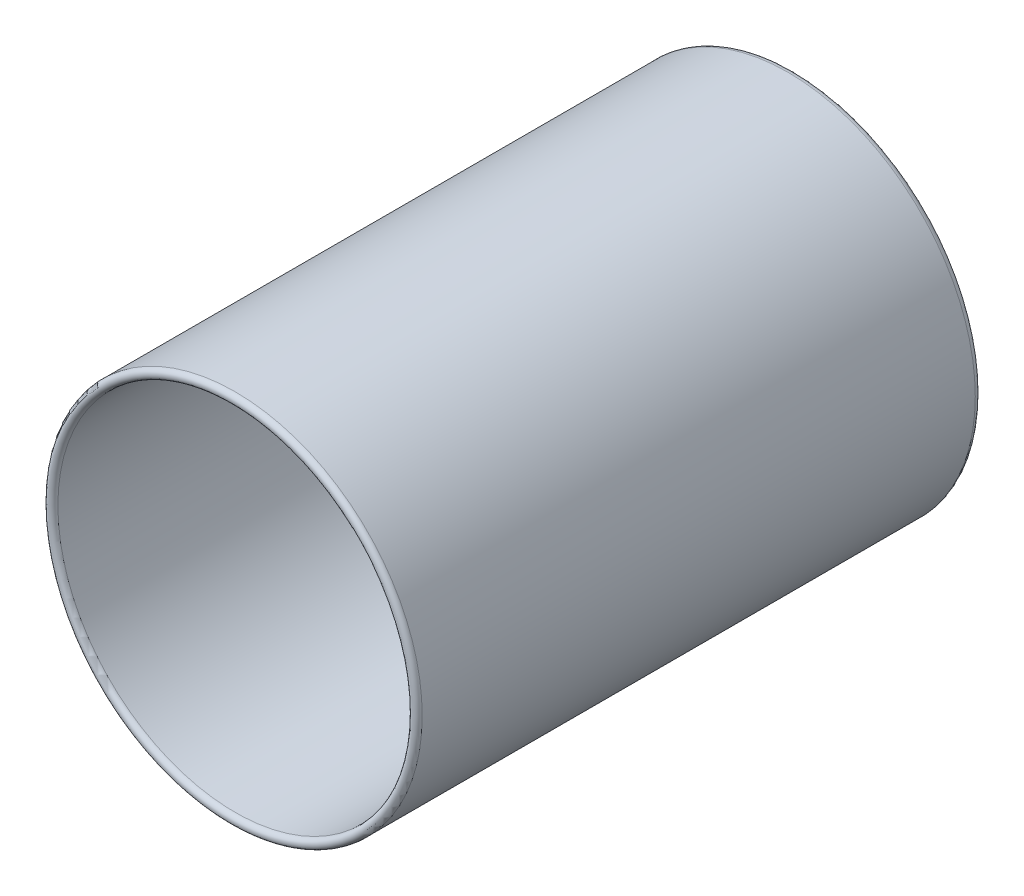
ISO-10303-21;
HEADER;
FILE_DESCRIPTION(('STEP AP214'),'2;1');
FILE_NAME('part.step','',(''),(''),'','','');
FILE_SCHEMA(('AUTOMOTIVE_DESIGN { 1 0 10303 214 1 1 1 1 }'));
ENDSEC;
DATA;
#1=APPLICATION_CONTEXT('core data for automotive mechanical design processes');
#2=APPLICATION_PROTOCOL_DEFINITION('international standard','automotive_design',2000,#1);
#3=PRODUCT_CONTEXT('',#1,'mechanical');
#4=PRODUCT('Part','Part','',(#3));
#5=PRODUCT_RELATED_PRODUCT_CATEGORY('part','',(#4));
#6=PRODUCT_DEFINITION_FORMATION('','',#4);
#7=PRODUCT_DEFINITION_CONTEXT('part definition',#1,'design');
#8=PRODUCT_DEFINITION('design','',#6,#7);
#9=PRODUCT_DEFINITION_SHAPE('','',#8);
#10=(LENGTH_UNIT() NAMED_UNIT(*) SI_UNIT(.MILLI.,.METRE.));
#11=(NAMED_UNIT(*) PLANE_ANGLE_UNIT() SI_UNIT($,.RADIAN.));
#12=(NAMED_UNIT(*) SI_UNIT($,.STERADIAN.) SOLID_ANGLE_UNIT());
#13=UNCERTAINTY_MEASURE_WITH_UNIT(LENGTH_MEASURE(1.E-05),#10,'distance_accuracy_value','');
#14=(GEOMETRIC_REPRESENTATION_CONTEXT(3) GLOBAL_UNCERTAINTY_ASSIGNED_CONTEXT((#13)) GLOBAL_UNIT_ASSIGNED_CONTEXT((#10,
#11,#12)) REPRESENTATION_CONTEXT('',''));
#15=CARTESIAN_POINT('',(0.,0.,0.));
#16=DIRECTION('',(0.,0.,1.));
#17=DIRECTION('',(1.,0.,0.));
#18=AXIS2_PLACEMENT_3D('',#15,#16,#17);
#19=CARTESIAN_POINT('',(0.,0.,85.25));
#20=DIRECTION('',(0.,0.,1.));
#21=DIRECTION('',(1.,0.,0.));
#22=AXIS2_PLACEMENT_3D('',#19,#20,#21);
#23=TOROIDAL_SURFACE('',#22,27.75,0.750000000000002);
#24=CARTESIAN_POINT('',(0.,0.,85.25));
#25=DIRECTION('',(0.,0.,1.));
#26=DIRECTION('',(1.,0.,0.));
#27=AXIS2_PLACEMENT_3D('',#24,#25,#26);
#28=CIRCLE('',#27,28.5);
#29=CARTESIAN_POINT('',(28.5,0.,85.25));
#30=VERTEX_POINT('',#29);
#31=EDGE_CURVE('E53',#30,#30,#28,.F.);
#32=ORIENTED_EDGE('',*,*,#31,.F.);
#33=EDGE_LOOP('',(#32));
#34=FACE_BOUND('',#33,.T.);
#35=CARTESIAN_POINT('',(0.,0.,85.25));
#36=DIRECTION('',(0.,0.,1.));
#37=DIRECTION('',(1.,0.,0.));
#38=AXIS2_PLACEMENT_3D('',#35,#36,#37);
#39=CIRCLE('',#38,27.);
#40=CARTESIAN_POINT('',(27.,0.,85.25));
#41=VERTEX_POINT('',#40);
#42=EDGE_CURVE('E10',#41,#41,#39,.T.);
#43=ORIENTED_EDGE('',*,*,#42,.F.);
#44=EDGE_LOOP('',(#43));
#45=FACE_BOUND('',#44,.T.);
#46=ADVANCED_FACE('F45',(#34,#45),#23,.T.);
#47=CARTESIAN_POINT('',(0.,0.,86.));
#48=DIRECTION('',(0.,0.,-1.));
#49=DIRECTION('',(-1.,0.,0.));
#50=AXIS2_PLACEMENT_3D('',#47,#48,#49);
#51=CYLINDRICAL_SURFACE('',#50,28.5);
#52=ORIENTED_EDGE('',*,*,#31,.T.);
#53=EDGE_LOOP('',(#52));
#54=FACE_BOUND('',#53,.T.);
#55=CARTESIAN_POINT('',(0.,0.,1.));
#56=DIRECTION('',(0.,0.,1.));
#57=DIRECTION('',(1.,0.,0.));
#58=AXIS2_PLACEMENT_3D('',#55,#56,#57);
#59=CIRCLE('',#58,28.5);
#60=CARTESIAN_POINT('',(28.5,0.,1.));
#61=VERTEX_POINT('',#60);
#62=EDGE_CURVE('E63',#61,#61,#59,.T.);
#63=ORIENTED_EDGE('',*,*,#62,.T.);
#64=EDGE_LOOP('',(#63));
#65=FACE_BOUND('',#64,.T.);
#66=ADVANCED_FACE('F87',(#54,#65),#51,.T.);
#67=CARTESIAN_POINT('',(0.,0.,0.));
#68=DIRECTION('',(0.,0.,1.));
#69=DIRECTION('',(1.,0.,0.));
#70=AXIS2_PLACEMENT_3D('',#67,#68,#69);
#71=PLANE('',#70);
#72=CARTESIAN_POINT('',(0.,0.,0.));
#73=DIRECTION('',(0.,0.,1.));
#74=DIRECTION('',(1.,0.,0.));
#75=AXIS2_PLACEMENT_3D('',#72,#73,#74);
#76=CIRCLE('',#75,27.5);
#77=CARTESIAN_POINT('',(27.5,0.,0.));
#78=VERTEX_POINT('',#77);
#79=EDGE_CURVE('E58',#78,#78,#76,.F.);
#80=ORIENTED_EDGE('',*,*,#79,.T.);
#81=EDGE_LOOP('',(#80));
#82=FACE_BOUND('',#81,.T.);
#83=ADVANCED_FACE('F78',(#82),#71,.F.);
#84=CARTESIAN_POINT('',(0.,0.,1.99999999999999));
#85=DIRECTION('',(0.,0.,1.));
#86=DIRECTION('',(1.,0.,0.));
#87=AXIS2_PLACEMENT_3D('',#84,#85,#86);
#88=CYLINDRICAL_SURFACE('',#87,27.);
#89=CARTESIAN_POINT('',(0.,0.,1.99999999999999));
#90=DIRECTION('',(0.,0.,1.));
#91=DIRECTION('',(1.,0.,0.));
#92=AXIS2_PLACEMENT_3D('',#89,#90,#91);
#93=CIRCLE('',#92,27.);
#94=CARTESIAN_POINT('',(27.,0.,1.99999999999999));
#95=VERTEX_POINT('',#94);
#96=EDGE_CURVE('E69',#95,#95,#93,.T.);
#97=CARTESIAN_POINT('',(27.,0.,85.25));
#98=CARTESIAN_POINT('',(27.,0.,84.3828125));
#99=CARTESIAN_POINT('',(27.,0.,83.515625));
#100=CARTESIAN_POINT('',(27.,0.,81.78125));
#101=CARTESIAN_POINT('',(27.,0.,80.9140625));
#102=CARTESIAN_POINT('',(27.,0.,79.1796875));
#103=CARTESIAN_POINT('',(27.,0.,78.3125));
#104=CARTESIAN_POINT('',(27.,0.,76.578125));
#105=CARTESIAN_POINT('',(27.,0.,75.7109375));
#106=CARTESIAN_POINT('',(27.,0.,73.9765625));
#107=CARTESIAN_POINT('',(27.,0.,73.109375));
#108=CARTESIAN_POINT('',(27.,0.,71.375));
#109=CARTESIAN_POINT('',(27.,0.,70.5078125));
#110=CARTESIAN_POINT('',(27.,0.,68.7734375));
#111=CARTESIAN_POINT('',(27.,0.,67.90625));
#112=CARTESIAN_POINT('',(27.,0.,66.171875));
#113=CARTESIAN_POINT('',(27.,0.,65.3046875));
#114=CARTESIAN_POINT('',(27.,0.,63.5703125));
#115=CARTESIAN_POINT('',(27.,0.,62.703125));
#116=CARTESIAN_POINT('',(27.,0.,60.96875));
#117=CARTESIAN_POINT('',(27.,0.,60.1015625));
#118=CARTESIAN_POINT('',(27.,0.,58.3671875));
#119=CARTESIAN_POINT('',(27.,0.,57.5));
#120=CARTESIAN_POINT('',(27.,0.,55.765625));
#121=CARTESIAN_POINT('',(27.,0.,54.8984375));
#122=CARTESIAN_POINT('',(27.,0.,53.1640625));
#123=CARTESIAN_POINT('',(27.,0.,52.296875));
#124=CARTESIAN_POINT('',(27.,0.,50.5625));
#125=CARTESIAN_POINT('',(27.,0.,49.6953125));
#126=CARTESIAN_POINT('',(27.,0.,47.9609375));
#127=CARTESIAN_POINT('',(27.,0.,47.09375));
#128=CARTESIAN_POINT('',(27.,0.,45.359375));
#129=CARTESIAN_POINT('',(27.,0.,44.4921875));
#130=CARTESIAN_POINT('',(27.,0.,42.7578125));
#131=CARTESIAN_POINT('',(27.,0.,41.890625));
#132=CARTESIAN_POINT('',(27.,0.,40.15625));
#133=CARTESIAN_POINT('',(27.,0.,39.2890625));
#134=CARTESIAN_POINT('',(27.,0.,37.5546875));
#135=CARTESIAN_POINT('',(27.,0.,36.6875));
#136=CARTESIAN_POINT('',(27.,0.,34.953125));
#137=CARTESIAN_POINT('',(27.,0.,34.0859375));
#138=CARTESIAN_POINT('',(27.,0.,32.3515625));
#139=CARTESIAN_POINT('',(27.,0.,31.484375));
#140=CARTESIAN_POINT('',(27.,0.,29.75));
#141=CARTESIAN_POINT('',(27.,0.,28.8828125));
#142=CARTESIAN_POINT('',(27.,0.,27.1484375));
#143=CARTESIAN_POINT('',(27.,0.,26.28125));
#144=CARTESIAN_POINT('',(27.,0.,24.546875));
#145=CARTESIAN_POINT('',(27.,0.,23.6796875));
#146=CARTESIAN_POINT('',(27.,0.,21.9453125));
#147=CARTESIAN_POINT('',(27.,0.,21.078125));
#148=CARTESIAN_POINT('',(27.,0.,19.34375));
#149=CARTESIAN_POINT('',(27.,0.,18.4765625));
#150=CARTESIAN_POINT('',(27.,0.,16.7421875));
#151=CARTESIAN_POINT('',(27.,0.,15.875));
#152=CARTESIAN_POINT('',(27.,0.,14.140625));
#153=CARTESIAN_POINT('',(27.,0.,13.2734375));
#154=CARTESIAN_POINT('',(27.,0.,11.5390625));
#155=CARTESIAN_POINT('',(27.,0.,10.671875));
#156=CARTESIAN_POINT('',(27.,0.,8.93749999999999));
#157=CARTESIAN_POINT('',(27.,0.,8.07031249999999));
#158=CARTESIAN_POINT('',(27.,0.,6.33593749999999));
#159=CARTESIAN_POINT('',(27.,0.,5.46874999999999));
#160=CARTESIAN_POINT('',(27.,0.,3.73437499999999));
#161=CARTESIAN_POINT('',(27.,0.,2.86718749999999));
#162=CARTESIAN_POINT('',(27.,0.,1.99999999999999));
#163=B_SPLINE_CURVE_WITH_KNOTS('',3,(#97,#98,#99,#100,#101,#102,#103,#104,#105,#106,#107,#108,
#109,#110,#111,#112,#113,#114,#115,#116,#117,#118,#119,#120,#121,#122,#123,#124,#125,#126,#127,
#128,#129,#130,#131,#132,#133,#134,#135,#136,#137,#138,#139,#140,#141,#142,#143,#144,#145,#146,
#147,#148,#149,#150,#151,#152,#153,#154,#155,#156,#157,#158,#159,#160,#161,#162),.UNSPECIFIED.,
.F.,.F.,(4,2,2,2,2,2,2,2,2,2,2,2,2,2,2,2,2,2,2,2,2,2,2,2,2,2,2,2,2,2,2,2,4),(0.,2.6015625,
5.203125,7.8046875,10.40625,13.0078125,15.609375,18.2109375,20.8125,23.4140625,26.015625,
28.6171875,31.21875,33.8203125,36.421875,39.0234375,41.625,44.2265625,46.828125,49.4296875,
52.03125,54.6328125,57.234375,59.8359375,62.4375,65.0390625,67.640625,70.2421875,72.84375,
75.4453125,78.046875,80.6484375,83.25),.UNSPECIFIED.);
#164=EDGE_CURVE('BSEAM76',#41,#95,#163,.T.);
#165=ORIENTED_EDGE('',*,*,#42,.T.);
#166=ORIENTED_EDGE('',*,*,#96,.F.);
#167=ORIENTED_EDGE('',*,*,#164,.T.);
#168=ORIENTED_EDGE('',*,*,#164,.F.);
#169=EDGE_LOOP('',(#165,#167,#166,#168));
#170=FACE_BOUND('',#169,.T.);
#171=ADVANCED_FACE('F76',(#170),#88,.F.);
#172=CARTESIAN_POINT('',(0.,0.,1.99999999999999));
#173=DIRECTION('',(0.,0.,1.));
#174=DIRECTION('',(1.,0.,0.));
#175=AXIS2_PLACEMENT_3D('',#172,#173,#174);
#176=PLANE('',#175);
#177=ORIENTED_EDGE('',*,*,#96,.T.);
#178=EDGE_LOOP('',(#177));
#179=FACE_BOUND('',#178,.T.);
#180=ADVANCED_FACE('F74',(#179),#176,.T.);
#181=CARTESIAN_POINT('',(0.,0.,1.));
#182=DIRECTION('',(0.,0.,1.));
#183=DIRECTION('',(1.,0.,0.));
#184=AXIS2_PLACEMENT_3D('',#181,#182,#183);
#185=TOROIDAL_SURFACE('',#184,27.5,1.);
#186=ORIENTED_EDGE('',*,*,#79,.F.);
#187=EDGE_LOOP('',(#186));
#188=FACE_BOUND('',#187,.T.);
#189=ORIENTED_EDGE('',*,*,#62,.F.);
#190=EDGE_LOOP('',(#189));
#191=FACE_BOUND('',#190,.T.);
#192=ADVANCED_FACE('F84',(#188,#191),#185,.T.);
#193=CLOSED_SHELL('',(#46,#66,#83,#171,#180,#192));
#194=MANIFOLD_SOLID_BREP('B2',#193);
#195=ADVANCED_BREP_SHAPE_REPRESENTATION('',(#18,#194),#14);
#196=SHAPE_DEFINITION_REPRESENTATION(#9,#195);
ENDSEC;
END-ISO-10303-21;
